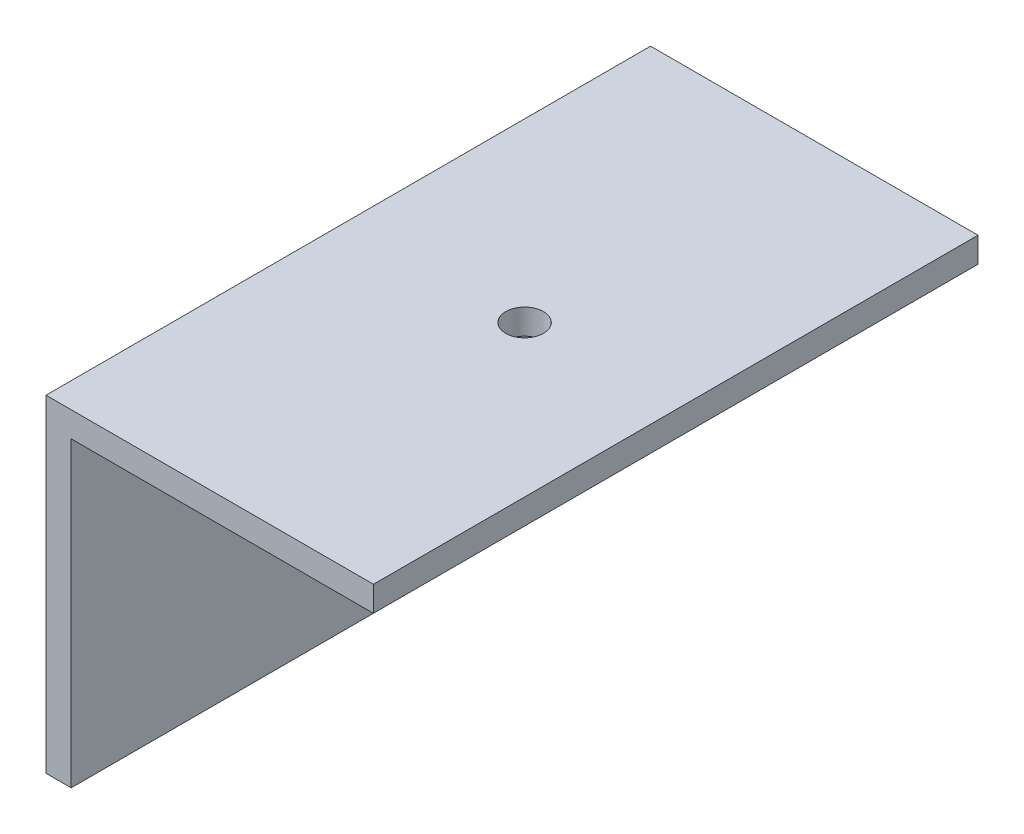
ISO-10303-21;
HEADER;
FILE_DESCRIPTION(('STEP AP214'),'2;1');
FILE_NAME('part.step','',(''),(''),'','','');
FILE_SCHEMA(('AUTOMOTIVE_DESIGN { 1 0 10303 214 1 1 1 1 }'));
ENDSEC;
DATA;
#1=APPLICATION_CONTEXT('core data for automotive mechanical design processes');
#2=APPLICATION_PROTOCOL_DEFINITION('international standard','automotive_design',2000,#1);
#3=PRODUCT_CONTEXT('',#1,'mechanical');
#4=PRODUCT('Part','Part','',(#3));
#5=PRODUCT_RELATED_PRODUCT_CATEGORY('part','',(#4));
#6=PRODUCT_DEFINITION_FORMATION('','',#4);
#7=PRODUCT_DEFINITION_CONTEXT('part definition',#1,'design');
#8=PRODUCT_DEFINITION('design','',#6,#7);
#9=PRODUCT_DEFINITION_SHAPE('','',#8);
#10=(LENGTH_UNIT() NAMED_UNIT(*) SI_UNIT(.MILLI.,.METRE.));
#11=(NAMED_UNIT(*) PLANE_ANGLE_UNIT() SI_UNIT($,.RADIAN.));
#12=(NAMED_UNIT(*) SI_UNIT($,.STERADIAN.) SOLID_ANGLE_UNIT());
#13=UNCERTAINTY_MEASURE_WITH_UNIT(LENGTH_MEASURE(1.E-05),#10,'distance_accuracy_value','');
#14=(GEOMETRIC_REPRESENTATION_CONTEXT(3) GLOBAL_UNCERTAINTY_ASSIGNED_CONTEXT((#13)) GLOBAL_UNIT_ASSIGNED_CONTEXT((#10,
#11,#12)) REPRESENTATION_CONTEXT('',''));
#15=CARTESIAN_POINT('',(0.,0.,0.));
#16=DIRECTION('',(0.,0.,1.));
#17=DIRECTION('',(1.,0.,0.));
#18=AXIS2_PLACEMENT_3D('',#15,#16,#17);
#19=CARTESIAN_POINT('',(12.7,0.,304.8));
#20=DIRECTION('',(0.,1.,0.));
#21=DIRECTION('',(0.,0.,1.));
#22=AXIS2_PLACEMENT_3D('',#19,#20,#21);
#23=PLANE('',#22);
#24=DIRECTION('',(1.,0.,0.));
#25=VECTOR('',#24,1.);
#26=CARTESIAN_POINT('',(12.7,0.,0.));
#27=LINE('',#26,#25);
#28=CARTESIAN_POINT('',(0.,0.,0.));
#29=VERTEX_POINT('',#28);
#30=CARTESIAN_POINT('',(12.7,0.,0.));
#31=VERTEX_POINT('',#30);
#32=EDGE_CURVE('E117',#29,#31,#27,.T.);
#33=ORIENTED_EDGE('',*,*,#32,.T.);
#34=DIRECTION('',(0.,0.,-1.));
#35=VECTOR('',#34,1.);
#36=CARTESIAN_POINT('',(12.7,0.,304.8));
#37=LINE('',#36,#35);
#38=CARTESIAN_POINT('',(12.7,0.,304.8));
#39=VERTEX_POINT('',#38);
#40=EDGE_CURVE('E11',#39,#31,#37,.T.);
#41=ORIENTED_EDGE('',*,*,#40,.F.);
#42=DIRECTION('',(1.,0.,0.));
#43=VECTOR('',#42,1.);
#44=CARTESIAN_POINT('',(12.7,0.,304.8));
#45=LINE('',#44,#43);
#46=CARTESIAN_POINT('',(0.,0.,304.8));
#47=VERTEX_POINT('',#46);
#48=EDGE_CURVE('E128',#47,#39,#45,.T.);
#49=ORIENTED_EDGE('',*,*,#48,.F.);
#50=DIRECTION('',(0.,0.,-1.));
#51=VECTOR('',#50,1.);
#52=CARTESIAN_POINT('',(0.,0.,304.8));
#53=LINE('',#52,#51);
#54=EDGE_CURVE('E113',#47,#29,#53,.T.);
#55=ORIENTED_EDGE('',*,*,#54,.T.);
#56=EDGE_LOOP('',(#33,#41,#49,#55));
#57=FACE_BOUND('',#56,.T.);
#58=ADVANCED_FACE('F33',(#57),#23,.F.);
#59=CARTESIAN_POINT('',(12.7,152.4,304.8));
#60=DIRECTION('',(-1.,0.,0.));
#61=DIRECTION('',(0.,-1.,0.));
#62=AXIS2_PLACEMENT_3D('',#59,#60,#61);
#63=PLANE('',#62);
#64=DIRECTION('',(0.,1.,0.));
#65=VECTOR('',#64,1.);
#66=CARTESIAN_POINT('',(12.7,152.4,0.));
#67=LINE('',#66,#65);
#68=CARTESIAN_POINT('',(12.7,152.4,0.));
#69=VERTEX_POINT('',#68);
#70=EDGE_CURVE('E120',#31,#69,#67,.T.);
#71=ORIENTED_EDGE('',*,*,#70,.T.);
#72=DIRECTION('',(0.,0.,-1.));
#73=VECTOR('',#72,1.);
#74=CARTESIAN_POINT('',(12.7,152.4,304.8));
#75=LINE('',#74,#73);
#76=CARTESIAN_POINT('',(12.7,152.4,304.8));
#77=VERTEX_POINT('',#76);
#78=EDGE_CURVE('E41',#77,#69,#75,.T.);
#79=ORIENTED_EDGE('',*,*,#78,.F.);
#80=DIRECTION('',(0.,1.,0.));
#81=VECTOR('',#80,1.);
#82=CARTESIAN_POINT('',(12.7,152.4,304.8));
#83=LINE('',#82,#81);
#84=EDGE_CURVE('E86',#39,#77,#83,.T.);
#85=ORIENTED_EDGE('',*,*,#84,.F.);
#86=ORIENTED_EDGE('',*,*,#40,.T.);
#87=EDGE_LOOP('',(#71,#79,#85,#86));
#88=FACE_BOUND('',#87,.T.);
#89=ADVANCED_FACE('F153',(#88),#63,.F.);
#90=CARTESIAN_POINT('',(165.1,152.4,304.8));
#91=DIRECTION('',(0.,1.,0.));
#92=DIRECTION('',(-1.,0.,0.));
#93=AXIS2_PLACEMENT_3D('',#90,#91,#92);
#94=PLANE('',#93);
#95=CARTESIAN_POINT('',(88.9,152.4,152.4));
#96=DIRECTION('',(0.,-1.,0.));
#97=DIRECTION('',(1.,0.,0.));
#98=AXIS2_PLACEMENT_3D('',#95,#96,#97);
#99=CIRCLE('',#98,9.525);
#100=CARTESIAN_POINT('',(98.425,152.4,152.4));
#101=VERTEX_POINT('',#100);
#102=EDGE_CURVE('E210',#101,#101,#99,.T.);
#103=ORIENTED_EDGE('',*,*,#102,.F.);
#104=EDGE_LOOP('',(#103));
#105=FACE_BOUND('',#104,.T.);
#106=DIRECTION('',(1.,0.,0.));
#107=VECTOR('',#106,1.);
#108=CARTESIAN_POINT('',(165.1,152.4,0.));
#109=LINE('',#108,#107);
#110=CARTESIAN_POINT('',(165.1,152.4,0.));
#111=VERTEX_POINT('',#110);
#112=EDGE_CURVE('E123',#69,#111,#109,.T.);
#113=ORIENTED_EDGE('',*,*,#112,.T.);
#114=DIRECTION('',(0.,0.,-1.));
#115=VECTOR('',#114,1.);
#116=CARTESIAN_POINT('',(165.1,152.4,304.8));
#117=LINE('',#116,#115);
#118=CARTESIAN_POINT('',(165.1,152.4,304.8));
#119=VERTEX_POINT('',#118);
#120=EDGE_CURVE('E108',#119,#111,#117,.T.);
#121=ORIENTED_EDGE('',*,*,#120,.F.);
#122=DIRECTION('',(1.,0.,0.));
#123=VECTOR('',#122,1.);
#124=CARTESIAN_POINT('',(165.1,152.4,304.8));
#125=LINE('',#124,#123);
#126=EDGE_CURVE('E99',#77,#119,#125,.T.);
#127=ORIENTED_EDGE('',*,*,#126,.F.);
#128=ORIENTED_EDGE('',*,*,#78,.T.);
#129=EDGE_LOOP('',(#113,#121,#127,#128));
#130=FACE_BOUND('',#129,.T.);
#131=ADVANCED_FACE('F134',(#105,#130),#94,.F.);
#132=CARTESIAN_POINT('',(165.1,165.1,304.8));
#133=DIRECTION('',(-1.,0.,0.));
#134=DIRECTION('',(0.,0.,1.));
#135=AXIS2_PLACEMENT_3D('',#132,#133,#134);
#136=PLANE('',#135);
#137=DIRECTION('',(0.,1.,0.));
#138=VECTOR('',#137,1.);
#139=CARTESIAN_POINT('',(165.1,165.1,0.));
#140=LINE('',#139,#138);
#141=CARTESIAN_POINT('',(165.1,165.1,0.));
#142=VERTEX_POINT('',#141);
#143=EDGE_CURVE('E107',#111,#142,#140,.T.);
#144=ORIENTED_EDGE('',*,*,#143,.T.);
#145=DIRECTION('',(0.,0.,-1.));
#146=VECTOR('',#145,1.);
#147=CARTESIAN_POINT('',(165.1,165.1,304.8));
#148=LINE('',#147,#146);
#149=CARTESIAN_POINT('',(165.1,165.1,304.8));
#150=VERTEX_POINT('',#149);
#151=EDGE_CURVE('E104',#150,#142,#148,.T.);
#152=ORIENTED_EDGE('',*,*,#151,.F.);
#153=DIRECTION('',(0.,1.,0.));
#154=VECTOR('',#153,1.);
#155=CARTESIAN_POINT('',(165.1,165.1,304.8));
#156=LINE('',#155,#154);
#157=EDGE_CURVE('E93',#119,#150,#156,.T.);
#158=ORIENTED_EDGE('',*,*,#157,.F.);
#159=ORIENTED_EDGE('',*,*,#120,.T.);
#160=EDGE_LOOP('',(#144,#152,#158,#159));
#161=FACE_BOUND('',#160,.T.);
#162=ADVANCED_FACE('F105',(#161),#136,.F.);
#163=CARTESIAN_POINT('',(0.,165.1,304.8));
#164=DIRECTION('',(0.,-1.,0.));
#165=DIRECTION('',(0.,0.,-1.));
#166=AXIS2_PLACEMENT_3D('',#163,#164,#165);
#167=PLANE('',#166);
#168=CARTESIAN_POINT('',(88.9,165.1,152.4));
#169=DIRECTION('',(0.,-1.,0.));
#170=DIRECTION('',(1.,0.,0.));
#171=AXIS2_PLACEMENT_3D('',#168,#169,#170);
#172=CIRCLE('',#171,9.525);
#173=CARTESIAN_POINT('',(98.425,165.1,152.4));
#174=VERTEX_POINT('',#173);
#175=EDGE_CURVE('E121',#174,#174,#172,.T.);
#176=ORIENTED_EDGE('',*,*,#175,.T.);
#177=EDGE_LOOP('',(#176));
#178=FACE_BOUND('',#177,.T.);
#179=DIRECTION('',(-1.,0.,0.));
#180=VECTOR('',#179,1.);
#181=CARTESIAN_POINT('',(0.,165.1,0.));
#182=LINE('',#181,#180);
#183=CARTESIAN_POINT('',(0.,165.1,0.));
#184=VERTEX_POINT('',#183);
#185=EDGE_CURVE('E72',#142,#184,#182,.T.);
#186=ORIENTED_EDGE('',*,*,#185,.T.);
#187=DIRECTION('',(0.,0.,-1.));
#188=VECTOR('',#187,1.);
#189=CARTESIAN_POINT('',(0.,165.1,304.8));
#190=LINE('',#189,#188);
#191=CARTESIAN_POINT('',(0.,165.1,304.8));
#192=VERTEX_POINT('',#191);
#193=EDGE_CURVE('E109',#192,#184,#190,.T.);
#194=ORIENTED_EDGE('',*,*,#193,.F.);
#195=DIRECTION('',(-1.,0.,0.));
#196=VECTOR('',#195,1.);
#197=CARTESIAN_POINT('',(0.,165.1,304.8));
#198=LINE('',#197,#196);
#199=EDGE_CURVE('E97',#150,#192,#198,.T.);
#200=ORIENTED_EDGE('',*,*,#199,.F.);
#201=ORIENTED_EDGE('',*,*,#151,.T.);
#202=EDGE_LOOP('',(#186,#194,#200,#201));
#203=FACE_BOUND('',#202,.T.);
#204=ADVANCED_FACE('F111',(#178,#203),#167,.F.);
#205=CARTESIAN_POINT('',(0.,0.,304.8));
#206=DIRECTION('',(1.,0.,0.));
#207=DIRECTION('',(0.,0.,-1.));
#208=AXIS2_PLACEMENT_3D('',#205,#206,#207);
#209=PLANE('',#208);
#210=DIRECTION('',(0.,-1.,0.));
#211=VECTOR('',#210,1.);
#212=CARTESIAN_POINT('',(0.,0.,0.));
#213=LINE('',#212,#211);
#214=EDGE_CURVE('E78',#184,#29,#213,.T.);
#215=ORIENTED_EDGE('',*,*,#214,.T.);
#216=ORIENTED_EDGE('',*,*,#54,.F.);
#217=DIRECTION('',(0.,-1.,0.));
#218=VECTOR('',#217,1.);
#219=CARTESIAN_POINT('',(0.,0.,304.8));
#220=LINE('',#219,#218);
#221=EDGE_CURVE('E49',#192,#47,#220,.T.);
#222=ORIENTED_EDGE('',*,*,#221,.F.);
#223=ORIENTED_EDGE('',*,*,#193,.T.);
#224=EDGE_LOOP('',(#215,#216,#222,#223));
#225=FACE_BOUND('',#224,.T.);
#226=ADVANCED_FACE('F141',(#225),#209,.F.);
#227=CARTESIAN_POINT('',(0.,0.,304.8));
#228=DIRECTION('',(0.,0.,-1.));
#229=DIRECTION('',(-1.,0.,0.));
#230=AXIS2_PLACEMENT_3D('',#227,#228,#229);
#231=PLANE('',#230);
#232=ORIENTED_EDGE('',*,*,#48,.T.);
#233=ORIENTED_EDGE('',*,*,#84,.T.);
#234=ORIENTED_EDGE('',*,*,#126,.T.);
#235=ORIENTED_EDGE('',*,*,#157,.T.);
#236=ORIENTED_EDGE('',*,*,#199,.T.);
#237=ORIENTED_EDGE('',*,*,#221,.T.);
#238=EDGE_LOOP('',(#232,#233,#234,#235,#236,#237));
#239=FACE_BOUND('',#238,.T.);
#240=ADVANCED_FACE('F95',(#239),#231,.F.);
#241=CARTESIAN_POINT('',(0.,0.,0.));
#242=DIRECTION('',(0.,0.,-1.));
#243=DIRECTION('',(-1.,0.,0.));
#244=AXIS2_PLACEMENT_3D('',#241,#242,#243);
#245=PLANE('',#244);
#246=ORIENTED_EDGE('',*,*,#32,.F.);
#247=ORIENTED_EDGE('',*,*,#214,.F.);
#248=ORIENTED_EDGE('',*,*,#185,.F.);
#249=ORIENTED_EDGE('',*,*,#143,.F.);
#250=ORIENTED_EDGE('',*,*,#112,.F.);
#251=ORIENTED_EDGE('',*,*,#70,.F.);
#252=EDGE_LOOP('',(#246,#247,#248,#249,#250,#251));
#253=FACE_BOUND('',#252,.T.);
#254=ADVANCED_FACE('F137',(#253),#245,.T.);
#255=CARTESIAN_POINT('',(88.9,165.1,152.4));
#256=DIRECTION('',(0.,-1.,0.));
#257=DIRECTION('',(1.,0.,0.));
#258=AXIS2_PLACEMENT_3D('',#255,#256,#257);
#259=CYLINDRICAL_SURFACE('',#258,9.525);
#260=ORIENTED_EDGE('',*,*,#175,.F.);
#261=EDGE_LOOP('',(#260));
#262=FACE_BOUND('',#261,.T.);
#263=ORIENTED_EDGE('',*,*,#102,.T.);
#264=EDGE_LOOP('',(#263));
#265=FACE_BOUND('',#264,.T.);
#266=ADVANCED_FACE('F181',(#262,#265),#259,.F.);
#267=CLOSED_SHELL('',(#58,#89,#131,#162,#204,#226,#240,#254,#266));
#268=MANIFOLD_SOLID_BREP('B2',#267);
#269=ADVANCED_BREP_SHAPE_REPRESENTATION('',(#18,#268),#14);
#270=SHAPE_DEFINITION_REPRESENTATION(#9,#269);
ENDSEC;
END-ISO-10303-21;
